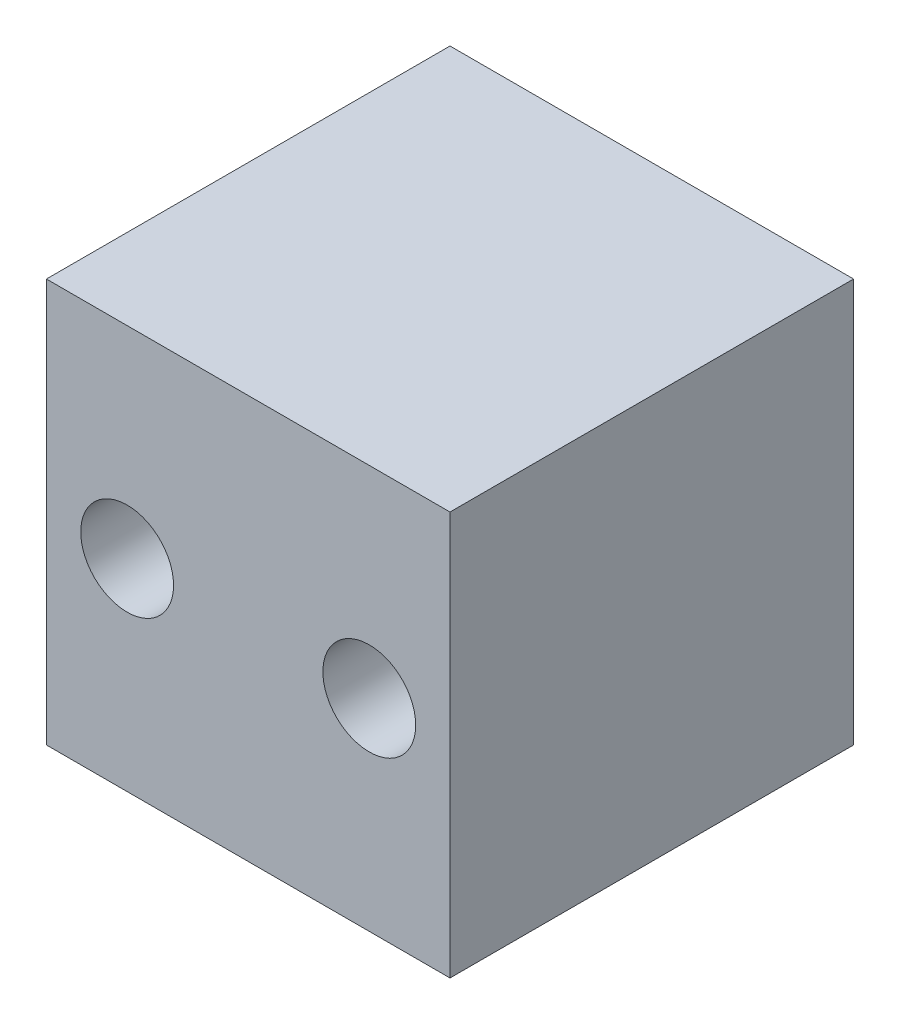
ISO-10303-21;
HEADER;
FILE_DESCRIPTION(('STEP AP214'),'2;1');
FILE_NAME('part.step','',(''),(''),'','','');
FILE_SCHEMA(('AUTOMOTIVE_DESIGN { 1 0 10303 214 1 1 1 1 }'));
ENDSEC;
DATA;
#1=APPLICATION_CONTEXT('core data for automotive mechanical design processes');
#2=APPLICATION_PROTOCOL_DEFINITION('international standard','automotive_design',2000,#1);
#3=PRODUCT_CONTEXT('',#1,'mechanical');
#4=PRODUCT('Part','Part','',(#3));
#5=PRODUCT_RELATED_PRODUCT_CATEGORY('part','',(#4));
#6=PRODUCT_DEFINITION_FORMATION('','',#4);
#7=PRODUCT_DEFINITION_CONTEXT('part definition',#1,'design');
#8=PRODUCT_DEFINITION('design','',#6,#7);
#9=PRODUCT_DEFINITION_SHAPE('','',#8);
#10=(LENGTH_UNIT() NAMED_UNIT(*) SI_UNIT(.MILLI.,.METRE.));
#11=(NAMED_UNIT(*) PLANE_ANGLE_UNIT() SI_UNIT($,.RADIAN.));
#12=(NAMED_UNIT(*) SI_UNIT($,.STERADIAN.) SOLID_ANGLE_UNIT());
#13=UNCERTAINTY_MEASURE_WITH_UNIT(LENGTH_MEASURE(1.E-05),#10,'distance_accuracy_value','');
#14=(GEOMETRIC_REPRESENTATION_CONTEXT(3) GLOBAL_UNCERTAINTY_ASSIGNED_CONTEXT((#13)) GLOBAL_UNIT_ASSIGNED_CONTEXT((#10,
#11,#12)) REPRESENTATION_CONTEXT('',''));
#15=CARTESIAN_POINT('',(0.,0.,0.));
#16=DIRECTION('',(0.,0.,1.));
#17=DIRECTION('',(1.,0.,0.));
#18=AXIS2_PLACEMENT_3D('',#15,#16,#17);
#19=CARTESIAN_POINT('',(-50.,-50.,100.));
#20=DIRECTION('',(1.,0.,0.));
#21=DIRECTION('',(0.,0.,-1.));
#22=AXIS2_PLACEMENT_3D('',#19,#20,#21);
#23=PLANE('',#22);
#24=DIRECTION('',(0.,-1.,0.));
#25=VECTOR('',#24,1.);
#26=CARTESIAN_POINT('',(-50.,-50.,0.));
#27=LINE('',#26,#25);
#28=CARTESIAN_POINT('',(-50.,50.,0.));
#29=VERTEX_POINT('',#28);
#30=CARTESIAN_POINT('',(-50.,-50.,0.));
#31=VERTEX_POINT('',#30);
#32=EDGE_CURVE('E96',#29,#31,#27,.T.);
#33=ORIENTED_EDGE('',*,*,#32,.T.);
#34=DIRECTION('',(0.,0.,-1.));
#35=VECTOR('',#34,1.);
#36=CARTESIAN_POINT('',(-50.,-50.,100.));
#37=LINE('',#36,#35);
#38=CARTESIAN_POINT('',(-50.,-50.,100.));
#39=VERTEX_POINT('',#38);
#40=EDGE_CURVE('E11',#39,#31,#37,.T.);
#41=ORIENTED_EDGE('',*,*,#40,.F.);
#42=DIRECTION('',(0.,-1.,0.));
#43=VECTOR('',#42,1.);
#44=CARTESIAN_POINT('',(-50.,-50.,100.));
#45=LINE('',#44,#43);
#46=CARTESIAN_POINT('',(-50.,50.,100.));
#47=VERTEX_POINT('',#46);
#48=EDGE_CURVE('E84',#47,#39,#45,.T.);
#49=ORIENTED_EDGE('',*,*,#48,.F.);
#50=DIRECTION('',(0.,0.,-1.));
#51=VECTOR('',#50,1.);
#52=CARTESIAN_POINT('',(-50.,50.,100.));
#53=LINE('',#52,#51);
#54=EDGE_CURVE('E92',#47,#29,#53,.T.);
#55=ORIENTED_EDGE('',*,*,#54,.T.);
#56=EDGE_LOOP('',(#33,#41,#49,#55));
#57=FACE_BOUND('',#56,.T.);
#58=ADVANCED_FACE('F33',(#57),#23,.F.);
#59=CARTESIAN_POINT('',(50.,-50.,100.));
#60=DIRECTION('',(0.,1.,0.));
#61=DIRECTION('',(-1.,0.,0.));
#62=AXIS2_PLACEMENT_3D('',#59,#60,#61);
#63=PLANE('',#62);
#64=DIRECTION('',(1.,0.,0.));
#65=VECTOR('',#64,1.);
#66=CARTESIAN_POINT('',(50.,-50.,0.));
#67=LINE('',#66,#65);
#68=CARTESIAN_POINT('',(50.,-50.,0.));
#69=VERTEX_POINT('',#68);
#70=EDGE_CURVE('E88',#31,#69,#67,.T.);
#71=ORIENTED_EDGE('',*,*,#70,.T.);
#72=DIRECTION('',(0.,0.,-1.));
#73=VECTOR('',#72,1.);
#74=CARTESIAN_POINT('',(50.,-50.,100.));
#75=LINE('',#74,#73);
#76=CARTESIAN_POINT('',(50.,-50.,100.));
#77=VERTEX_POINT('',#76);
#78=EDGE_CURVE('E41',#77,#69,#75,.T.);
#79=ORIENTED_EDGE('',*,*,#78,.F.);
#80=DIRECTION('',(1.,0.,0.));
#81=VECTOR('',#80,1.);
#82=CARTESIAN_POINT('',(50.,-50.,100.));
#83=LINE('',#82,#81);
#84=EDGE_CURVE('E79',#39,#77,#83,.T.);
#85=ORIENTED_EDGE('',*,*,#84,.F.);
#86=ORIENTED_EDGE('',*,*,#40,.T.);
#87=EDGE_LOOP('',(#71,#79,#85,#86));
#88=FACE_BOUND('',#87,.T.);
#89=ADVANCED_FACE('F87',(#88),#63,.F.);
#90=CARTESIAN_POINT('',(50.,-50.,100.));
#91=DIRECTION('',(-1.,0.,0.));
#92=DIRECTION('',(0.,0.,1.));
#93=AXIS2_PLACEMENT_3D('',#90,#91,#92);
#94=PLANE('',#93);
#95=DIRECTION('',(0.,1.,0.));
#96=VECTOR('',#95,1.);
#97=CARTESIAN_POINT('',(50.,-50.,0.));
#98=LINE('',#97,#96);
#99=CARTESIAN_POINT('',(50.,50.,0.));
#100=VERTEX_POINT('',#99);
#101=EDGE_CURVE('E66',#69,#100,#98,.T.);
#102=ORIENTED_EDGE('',*,*,#101,.T.);
#103=DIRECTION('',(0.,0.,-1.));
#104=VECTOR('',#103,1.);
#105=CARTESIAN_POINT('',(50.,50.,100.));
#106=LINE('',#105,#104);
#107=CARTESIAN_POINT('',(50.,50.,100.));
#108=VERTEX_POINT('',#107);
#109=EDGE_CURVE('E89',#108,#100,#106,.T.);
#110=ORIENTED_EDGE('',*,*,#109,.F.);
#111=DIRECTION('',(0.,1.,0.));
#112=VECTOR('',#111,1.);
#113=CARTESIAN_POINT('',(50.,-50.,100.));
#114=LINE('',#113,#112);
#115=EDGE_CURVE('E82',#77,#108,#114,.T.);
#116=ORIENTED_EDGE('',*,*,#115,.F.);
#117=ORIENTED_EDGE('',*,*,#78,.T.);
#118=EDGE_LOOP('',(#102,#110,#116,#117));
#119=FACE_BOUND('',#118,.T.);
#120=ADVANCED_FACE('F90',(#119),#94,.F.);
#121=CARTESIAN_POINT('',(50.,50.,100.));
#122=DIRECTION('',(0.,-1.,0.));
#123=DIRECTION('',(1.,0.,0.));
#124=AXIS2_PLACEMENT_3D('',#121,#122,#123);
#125=PLANE('',#124);
#126=DIRECTION('',(-1.,0.,0.));
#127=VECTOR('',#126,1.);
#128=CARTESIAN_POINT('',(50.,50.,0.));
#129=LINE('',#128,#127);
#130=EDGE_CURVE('E72',#100,#29,#129,.T.);
#131=ORIENTED_EDGE('',*,*,#130,.T.);
#132=ORIENTED_EDGE('',*,*,#54,.F.);
#133=DIRECTION('',(-1.,0.,0.));
#134=VECTOR('',#133,1.);
#135=CARTESIAN_POINT('',(50.,50.,100.));
#136=LINE('',#135,#134);
#137=EDGE_CURVE('E49',#108,#47,#136,.T.);
#138=ORIENTED_EDGE('',*,*,#137,.F.);
#139=ORIENTED_EDGE('',*,*,#109,.T.);
#140=EDGE_LOOP('',(#131,#132,#138,#139));
#141=FACE_BOUND('',#140,.T.);
#142=ADVANCED_FACE('F104',(#141),#125,.F.);
#143=CARTESIAN_POINT('',(0.,0.,100.));
#144=DIRECTION('',(0.,0.,1.));
#145=DIRECTION('',(1.,0.,0.));
#146=AXIS2_PLACEMENT_3D('',#143,#144,#145);
#147=PLANE('',#146);
#148=CARTESIAN_POINT('',(30.,0.,100.));
#149=DIRECTION('',(0.,0.,1.));
#150=DIRECTION('',(1.,0.,0.));
#151=AXIS2_PLACEMENT_3D('',#148,#149,#150);
#152=CIRCLE('',#151,11.5);
#153=CARTESIAN_POINT('',(41.5,0.,100.));
#154=VERTEX_POINT('',#153);
#155=EDGE_CURVE('E130',#154,#154,#152,.T.);
#156=ORIENTED_EDGE('',*,*,#155,.F.);
#157=EDGE_LOOP('',(#156));
#158=FACE_BOUND('',#157,.T.);
#159=CARTESIAN_POINT('',(-30.,0.,100.));
#160=DIRECTION('',(0.,0.,1.));
#161=DIRECTION('',(1.,0.,0.));
#162=AXIS2_PLACEMENT_3D('',#159,#160,#161);
#163=CIRCLE('',#162,11.5);
#164=CARTESIAN_POINT('',(-18.5,0.,100.));
#165=VERTEX_POINT('',#164);
#166=EDGE_CURVE('E118',#165,#165,#163,.T.);
#167=ORIENTED_EDGE('',*,*,#166,.F.);
#168=EDGE_LOOP('',(#167));
#169=FACE_BOUND('',#168,.T.);
#170=ORIENTED_EDGE('',*,*,#48,.T.);
#171=ORIENTED_EDGE('',*,*,#84,.T.);
#172=ORIENTED_EDGE('',*,*,#115,.T.);
#173=ORIENTED_EDGE('',*,*,#137,.T.);
#174=EDGE_LOOP('',(#170,#171,#172,#173));
#175=FACE_BOUND('',#174,.T.);
#176=ADVANCED_FACE('F80',(#158,#169,#175),#147,.T.);
#177=CARTESIAN_POINT('',(0.,0.,0.));
#178=DIRECTION('',(0.,0.,1.));
#179=DIRECTION('',(1.,0.,0.));
#180=AXIS2_PLACEMENT_3D('',#177,#178,#179);
#181=PLANE('',#180);
#182=CARTESIAN_POINT('',(30.,0.,0.));
#183=DIRECTION('',(0.,0.,1.));
#184=DIRECTION('',(1.,0.,0.));
#185=AXIS2_PLACEMENT_3D('',#182,#183,#184);
#186=CIRCLE('',#185,4.49999999999998);
#187=CARTESIAN_POINT('',(34.5,0.,0.));
#188=VERTEX_POINT('',#187);
#189=EDGE_CURVE('E121',#188,#188,#186,.T.);
#190=ORIENTED_EDGE('',*,*,#189,.T.);
#191=EDGE_LOOP('',(#190));
#192=FACE_BOUND('',#191,.T.);
#193=CARTESIAN_POINT('',(-30.,0.,0.));
#194=DIRECTION('',(0.,0.,1.));
#195=DIRECTION('',(1.,0.,0.));
#196=AXIS2_PLACEMENT_3D('',#193,#194,#195);
#197=CIRCLE('',#196,4.49999999999998);
#198=CARTESIAN_POINT('',(-25.5,0.,0.));
#199=VERTEX_POINT('',#198);
#200=EDGE_CURVE('E99',#199,#199,#197,.T.);
#201=ORIENTED_EDGE('',*,*,#200,.T.);
#202=EDGE_LOOP('',(#201));
#203=FACE_BOUND('',#202,.T.);
#204=ORIENTED_EDGE('',*,*,#32,.F.);
#205=ORIENTED_EDGE('',*,*,#130,.F.);
#206=ORIENTED_EDGE('',*,*,#101,.F.);
#207=ORIENTED_EDGE('',*,*,#70,.F.);
#208=EDGE_LOOP('',(#204,#205,#206,#207));
#209=FACE_BOUND('',#208,.T.);
#210=ADVANCED_FACE('F107',(#192,#203,#209),#181,.F.);
#211=CARTESIAN_POINT('',(-30.,0.,100.));
#212=DIRECTION('',(0.,0.,1.));
#213=DIRECTION('',(1.,0.,0.));
#214=AXIS2_PLACEMENT_3D('',#211,#212,#213);
#215=CYLINDRICAL_SURFACE('',#214,4.49999999999998);
#216=ORIENTED_EDGE('',*,*,#200,.F.);
#217=EDGE_LOOP('',(#216));
#218=FACE_BOUND('',#217,.T.);
#219=CARTESIAN_POINT('',(-30.,0.,10.));
#220=DIRECTION('',(0.,0.,1.));
#221=DIRECTION('',(1.,0.,0.));
#222=AXIS2_PLACEMENT_3D('',#219,#220,#221);
#223=CIRCLE('',#222,4.49999999999998);
#224=CARTESIAN_POINT('',(-25.5,0.,10.));
#225=VERTEX_POINT('',#224);
#226=EDGE_CURVE('E112',#225,#225,#223,.T.);
#227=ORIENTED_EDGE('',*,*,#226,.T.);
#228=EDGE_LOOP('',(#227));
#229=FACE_BOUND('',#228,.T.);
#230=ADVANCED_FACE('F154',(#218,#229),#215,.F.);
#231=CARTESIAN_POINT('',(-25.5,0.,10.));
#232=DIRECTION('',(0.,0.,-1.));
#233=DIRECTION('',(-1.,0.,0.));
#234=AXIS2_PLACEMENT_3D('',#231,#232,#233);
#235=PLANE('',#234);
#236=ORIENTED_EDGE('',*,*,#226,.F.);
#237=EDGE_LOOP('',(#236));
#238=FACE_BOUND('',#237,.T.);
#239=CARTESIAN_POINT('',(-30.,0.,10.));
#240=DIRECTION('',(0.,0.,1.));
#241=DIRECTION('',(1.,0.,0.));
#242=AXIS2_PLACEMENT_3D('',#239,#240,#241);
#243=CIRCLE('',#242,11.5);
#244=CARTESIAN_POINT('',(-18.5,0.,10.));
#245=VERTEX_POINT('',#244);
#246=EDGE_CURVE('E115',#245,#245,#243,.T.);
#247=ORIENTED_EDGE('',*,*,#246,.T.);
#248=EDGE_LOOP('',(#247));
#249=FACE_BOUND('',#248,.T.);
#250=ADVANCED_FACE('F144',(#238,#249),#235,.F.);
#251=CARTESIAN_POINT('',(-30.,0.,100.));
#252=DIRECTION('',(0.,0.,1.));
#253=DIRECTION('',(1.,0.,0.));
#254=AXIS2_PLACEMENT_3D('',#251,#252,#253);
#255=CYLINDRICAL_SURFACE('',#254,11.5);
#256=ORIENTED_EDGE('',*,*,#246,.F.);
#257=EDGE_LOOP('',(#256));
#258=FACE_BOUND('',#257,.T.);
#259=ORIENTED_EDGE('',*,*,#166,.T.);
#260=EDGE_LOOP('',(#259));
#261=FACE_BOUND('',#260,.T.);
#262=ADVANCED_FACE('F141',(#258,#261),#255,.F.);
#263=CARTESIAN_POINT('',(30.,0.,100.));
#264=DIRECTION('',(0.,0.,1.));
#265=DIRECTION('',(1.,0.,0.));
#266=AXIS2_PLACEMENT_3D('',#263,#264,#265);
#267=CYLINDRICAL_SURFACE('',#266,4.49999999999998);
#268=ORIENTED_EDGE('',*,*,#189,.F.);
#269=EDGE_LOOP('',(#268));
#270=FACE_BOUND('',#269,.T.);
#271=CARTESIAN_POINT('',(30.,0.,10.));
#272=DIRECTION('',(0.,0.,1.));
#273=DIRECTION('',(1.,0.,0.));
#274=AXIS2_PLACEMENT_3D('',#271,#272,#273);
#275=CIRCLE('',#274,4.49999999999998);
#276=CARTESIAN_POINT('',(34.5,0.,10.));
#277=VERTEX_POINT('',#276);
#278=EDGE_CURVE('E124',#277,#277,#275,.T.);
#279=ORIENTED_EDGE('',*,*,#278,.T.);
#280=EDGE_LOOP('',(#279));
#281=FACE_BOUND('',#280,.T.);
#282=ADVANCED_FACE('F143',(#270,#281),#267,.F.);
#283=CARTESIAN_POINT('',(34.5,0.,10.));
#284=DIRECTION('',(0.,0.,-1.));
#285=DIRECTION('',(-1.,0.,0.));
#286=AXIS2_PLACEMENT_3D('',#283,#284,#285);
#287=PLANE('',#286);
#288=ORIENTED_EDGE('',*,*,#278,.F.);
#289=EDGE_LOOP('',(#288));
#290=FACE_BOUND('',#289,.T.);
#291=CARTESIAN_POINT('',(30.,0.,10.));
#292=DIRECTION('',(0.,0.,1.));
#293=DIRECTION('',(1.,0.,0.));
#294=AXIS2_PLACEMENT_3D('',#291,#292,#293);
#295=CIRCLE('',#294,11.5);
#296=CARTESIAN_POINT('',(41.5,0.,10.));
#297=VERTEX_POINT('',#296);
#298=EDGE_CURVE('E127',#297,#297,#295,.T.);
#299=ORIENTED_EDGE('',*,*,#298,.T.);
#300=EDGE_LOOP('',(#299));
#301=FACE_BOUND('',#300,.T.);
#302=ADVANCED_FACE('F151',(#290,#301),#287,.F.);
#303=CARTESIAN_POINT('',(30.,0.,100.));
#304=DIRECTION('',(0.,0.,1.));
#305=DIRECTION('',(1.,0.,0.));
#306=AXIS2_PLACEMENT_3D('',#303,#304,#305);
#307=CYLINDRICAL_SURFACE('',#306,11.5);
#308=ORIENTED_EDGE('',*,*,#298,.F.);
#309=EDGE_LOOP('',(#308));
#310=FACE_BOUND('',#309,.T.);
#311=ORIENTED_EDGE('',*,*,#155,.T.);
#312=EDGE_LOOP('',(#311));
#313=FACE_BOUND('',#312,.T.);
#314=ADVANCED_FACE('F134',(#310,#313),#307,.F.);
#315=CLOSED_SHELL('',(#58,#89,#120,#142,#176,#210,#230,#250,#262,#282,#302,#314));
#316=MANIFOLD_SOLID_BREP('B2',#315);
#317=ADVANCED_BREP_SHAPE_REPRESENTATION('',(#18,#316),#14);
#318=SHAPE_DEFINITION_REPRESENTATION(#9,#317);
ENDSEC;
END-ISO-10303-21;
